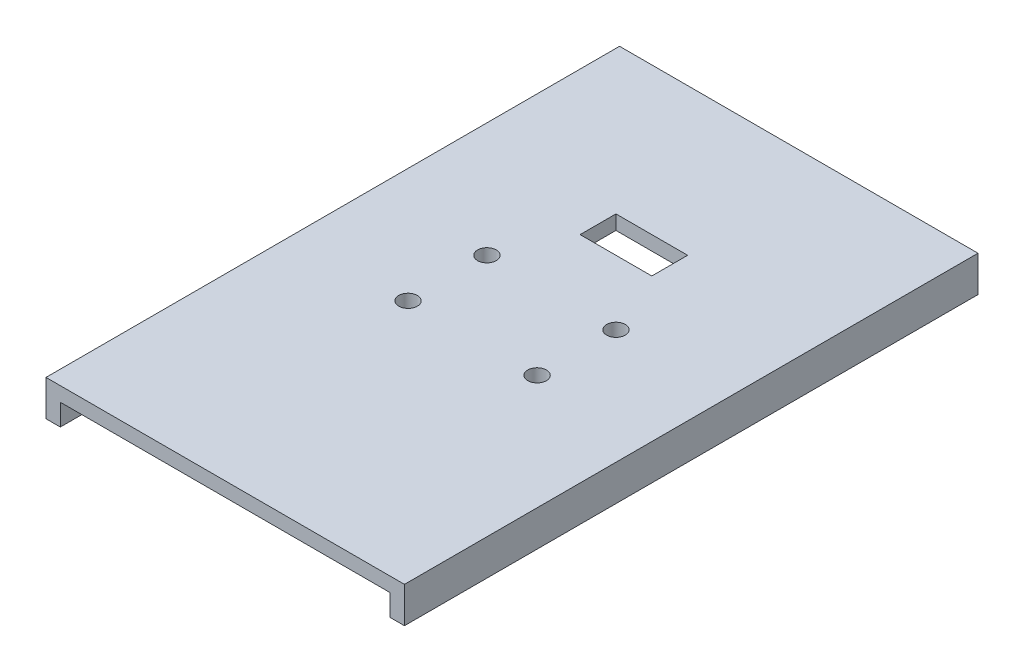
ISO-10303-21;
HEADER;
FILE_DESCRIPTION(('STEP AP214'),'2;1');
FILE_NAME('part.step','',(''),(''),'','','');
FILE_SCHEMA(('AUTOMOTIVE_DESIGN { 1 0 10303 214 1 1 1 1 }'));
ENDSEC;
DATA;
#1=APPLICATION_CONTEXT('core data for automotive mechanical design processes');
#2=APPLICATION_PROTOCOL_DEFINITION('international standard','automotive_design',2000,#1);
#3=PRODUCT_CONTEXT('',#1,'mechanical');
#4=PRODUCT('Part','Part','',(#3));
#5=PRODUCT_RELATED_PRODUCT_CATEGORY('part','',(#4));
#6=PRODUCT_DEFINITION_FORMATION('','',#4);
#7=PRODUCT_DEFINITION_CONTEXT('part definition',#1,'design');
#8=PRODUCT_DEFINITION('design','',#6,#7);
#9=PRODUCT_DEFINITION_SHAPE('','',#8);
#10=(LENGTH_UNIT() NAMED_UNIT(*) SI_UNIT(.MILLI.,.METRE.));
#11=(NAMED_UNIT(*) PLANE_ANGLE_UNIT() SI_UNIT($,.RADIAN.));
#12=(NAMED_UNIT(*) SI_UNIT($,.STERADIAN.) SOLID_ANGLE_UNIT());
#13=UNCERTAINTY_MEASURE_WITH_UNIT(LENGTH_MEASURE(1.E-05),#10,'distance_accuracy_value','');
#14=(GEOMETRIC_REPRESENTATION_CONTEXT(3) GLOBAL_UNCERTAINTY_ASSIGNED_CONTEXT((#13)) GLOBAL_UNIT_ASSIGNED_CONTEXT((#10,
#11,#12)) REPRESENTATION_CONTEXT('',''));
#15=CARTESIAN_POINT('',(0.,0.,0.));
#16=DIRECTION('',(0.,0.,1.));
#17=DIRECTION('',(1.,0.,0.));
#18=AXIS2_PLACEMENT_3D('',#15,#16,#17);
#19=CARTESIAN_POINT('',(0.,2.,0.));
#20=DIRECTION('',(0.,0.,-1.));
#21=DIRECTION('',(-1.,0.,0.));
#22=AXIS2_PLACEMENT_3D('',#19,#20,#21);
#23=PLANE('',#22);
#24=DIRECTION('',(1.,0.,0.));
#25=VECTOR('',#24,1.);
#26=CARTESIAN_POINT('',(0.,0.,0.));
#27=LINE('',#26,#25);
#28=CARTESIAN_POINT('',(-3.,0.,0.));
#29=VERTEX_POINT('',#28);
#30=CARTESIAN_POINT('',(43.,0.,0.));
#31=VERTEX_POINT('',#30);
#32=EDGE_CURVE('E217',#29,#31,#27,.T.);
#33=ORIENTED_EDGE('',*,*,#32,.T.);
#34=DIRECTION('',(0.,-1.,0.));
#35=VECTOR('',#34,1.);
#36=CARTESIAN_POINT('',(43.,-3.,0.));
#37=LINE('',#36,#35);
#38=CARTESIAN_POINT('',(43.,-3.,0.));
#39=VERTEX_POINT('',#38);
#40=EDGE_CURVE('E163',#31,#39,#37,.T.);
#41=ORIENTED_EDGE('',*,*,#40,.T.);
#42=DIRECTION('',(1.,0.,0.));
#43=VECTOR('',#42,1.);
#44=CARTESIAN_POINT('',(45.,-3.,0.));
#45=LINE('',#44,#43);
#46=CARTESIAN_POINT('',(45.,-3.,0.));
#47=VERTEX_POINT('',#46);
#48=EDGE_CURVE('E181',#39,#47,#45,.T.);
#49=ORIENTED_EDGE('',*,*,#48,.T.);
#50=DIRECTION('',(0.,1.,0.));
#51=VECTOR('',#50,1.);
#52=CARTESIAN_POINT('',(45.,2.,0.));
#53=LINE('',#52,#51);
#54=CARTESIAN_POINT('',(45.,2.,0.));
#55=VERTEX_POINT('',#54);
#56=EDGE_CURVE('E172',#47,#55,#53,.T.);
#57=ORIENTED_EDGE('',*,*,#56,.T.);
#58=DIRECTION('',(1.,0.,0.));
#59=VECTOR('',#58,1.);
#60=CARTESIAN_POINT('',(0.,2.,0.));
#61=LINE('',#60,#59);
#62=CARTESIAN_POINT('',(-5.,2.,0.));
#63=VERTEX_POINT('',#62);
#64=EDGE_CURVE('E40',#63,#55,#61,.T.);
#65=ORIENTED_EDGE('',*,*,#64,.F.);
#66=DIRECTION('',(0.,-1.,0.));
#67=VECTOR('',#66,1.);
#68=CARTESIAN_POINT('',(-5.,2.,0.));
#69=LINE('',#68,#67);
#70=CARTESIAN_POINT('',(-5.,-3.,0.));
#71=VERTEX_POINT('',#70);
#72=EDGE_CURVE('E189',#63,#71,#69,.T.);
#73=ORIENTED_EDGE('',*,*,#72,.T.);
#74=DIRECTION('',(1.,0.,0.));
#75=VECTOR('',#74,1.);
#76=CARTESIAN_POINT('',(-5.,-3.,0.));
#77=LINE('',#76,#75);
#78=CARTESIAN_POINT('',(-3.,-3.,0.));
#79=VERTEX_POINT('',#78);
#80=EDGE_CURVE('E209',#71,#79,#77,.T.);
#81=ORIENTED_EDGE('',*,*,#80,.T.);
#82=DIRECTION('',(0.,1.,0.));
#83=VECTOR('',#82,1.);
#84=CARTESIAN_POINT('',(-3.,-3.,0.));
#85=LINE('',#84,#83);
#86=EDGE_CURVE('E200',#79,#29,#85,.T.);
#87=ORIENTED_EDGE('',*,*,#86,.T.);
#88=EDGE_LOOP('',(#33,#41,#49,#57,#65,#73,#81,#87));
#89=FACE_BOUND('',#88,.T.);
#90=ADVANCED_FACE('F32',(#89),#23,.F.);
#91=CARTESIAN_POINT('',(0.,2.,-80.));
#92=DIRECTION('',(0.,0.,1.));
#93=DIRECTION('',(1.,0.,0.));
#94=AXIS2_PLACEMENT_3D('',#91,#92,#93);
#95=PLANE('',#94);
#96=DIRECTION('',(-1.,0.,0.));
#97=VECTOR('',#96,1.);
#98=CARTESIAN_POINT('',(0.,0.,-80.));
#99=LINE('',#98,#97);
#100=CARTESIAN_POINT('',(43.,0.,-80.));
#101=VERTEX_POINT('',#100);
#102=CARTESIAN_POINT('',(-3.,0.,-80.));
#103=VERTEX_POINT('',#102);
#104=EDGE_CURVE('E35',#101,#103,#99,.T.);
#105=ORIENTED_EDGE('',*,*,#104,.T.);
#106=DIRECTION('',(0.,1.,0.));
#107=VECTOR('',#106,1.);
#108=CARTESIAN_POINT('',(-3.,-3.,-80.));
#109=LINE('',#108,#107);
#110=CARTESIAN_POINT('',(-3.,-3.,-80.));
#111=VERTEX_POINT('',#110);
#112=EDGE_CURVE('E203',#111,#103,#109,.T.);
#113=ORIENTED_EDGE('',*,*,#112,.F.);
#114=DIRECTION('',(1.,0.,0.));
#115=VECTOR('',#114,1.);
#116=CARTESIAN_POINT('',(-5.,-3.,-80.));
#117=LINE('',#116,#115);
#118=CARTESIAN_POINT('',(-5.,-3.,-80.));
#119=VERTEX_POINT('',#118);
#120=EDGE_CURVE('E199',#119,#111,#117,.T.);
#121=ORIENTED_EDGE('',*,*,#120,.F.);
#122=DIRECTION('',(0.,-1.,0.));
#123=VECTOR('',#122,1.);
#124=CARTESIAN_POINT('',(-5.,2.,-80.));
#125=LINE('',#124,#123);
#126=CARTESIAN_POINT('',(-5.,2.,-80.));
#127=VERTEX_POINT('',#126);
#128=EDGE_CURVE('E196',#127,#119,#125,.T.);
#129=ORIENTED_EDGE('',*,*,#128,.F.);
#130=DIRECTION('',(-1.,0.,0.));
#131=VECTOR('',#130,1.);
#132=CARTESIAN_POINT('',(0.,2.,-80.));
#133=LINE('',#132,#131);
#134=CARTESIAN_POINT('',(45.,2.,-80.));
#135=VERTEX_POINT('',#134);
#136=EDGE_CURVE('E11',#135,#127,#133,.T.);
#137=ORIENTED_EDGE('',*,*,#136,.F.);
#138=DIRECTION('',(0.,1.,0.));
#139=VECTOR('',#138,1.);
#140=CARTESIAN_POINT('',(45.,2.,-80.));
#141=LINE('',#140,#139);
#142=CARTESIAN_POINT('',(45.,-3.,-80.));
#143=VERTEX_POINT('',#142);
#144=EDGE_CURVE('E175',#143,#135,#141,.T.);
#145=ORIENTED_EDGE('',*,*,#144,.F.);
#146=DIRECTION('',(1.,0.,0.));
#147=VECTOR('',#146,1.);
#148=CARTESIAN_POINT('',(45.,-3.,-80.));
#149=LINE('',#148,#147);
#150=CARTESIAN_POINT('',(43.,-3.,-80.));
#151=VERTEX_POINT('',#150);
#152=EDGE_CURVE('E171',#151,#143,#149,.T.);
#153=ORIENTED_EDGE('',*,*,#152,.F.);
#154=DIRECTION('',(0.,-1.,0.));
#155=VECTOR('',#154,1.);
#156=CARTESIAN_POINT('',(43.,-3.,-80.));
#157=LINE('',#156,#155);
#158=EDGE_CURVE('E168',#101,#151,#157,.T.);
#159=ORIENTED_EDGE('',*,*,#158,.F.);
#160=EDGE_LOOP('',(#105,#113,#121,#129,#137,#145,#153,#159));
#161=FACE_BOUND('',#160,.T.);
#162=ADVANCED_FACE('F229',(#161),#95,.F.);
#163=CARTESIAN_POINT('',(0.,2.,0.));
#164=DIRECTION('',(0.,-1.,0.));
#165=DIRECTION('',(0.,0.,-1.));
#166=AXIS2_PLACEMENT_3D('',#163,#164,#165);
#167=PLANE('',#166);
#168=DIRECTION('',(1.,0.,0.));
#169=VECTOR('',#168,1.);
#170=CARTESIAN_POINT('',(15.,2.,-54.5));
#171=LINE('',#170,#169);
#172=CARTESIAN_POINT('',(15.,2.,-54.5));
#173=VERTEX_POINT('',#172);
#174=CARTESIAN_POINT('',(25.,2.,-54.5));
#175=VERTEX_POINT('',#174);
#176=EDGE_CURVE('E151',#173,#175,#171,.T.);
#177=ORIENTED_EDGE('',*,*,#176,.F.);
#178=DIRECTION('',(0.,0.,1.));
#179=VECTOR('',#178,1.);
#180=CARTESIAN_POINT('',(15.,2.,-59.5));
#181=LINE('',#180,#179);
#182=CARTESIAN_POINT('',(15.,2.,-59.5));
#183=VERTEX_POINT('',#182);
#184=EDGE_CURVE('E48',#183,#173,#181,.T.);
#185=ORIENTED_EDGE('',*,*,#184,.F.);
#186=DIRECTION('',(-1.,0.,0.));
#187=VECTOR('',#186,1.);
#188=CARTESIAN_POINT('',(15.,2.,-59.5));
#189=LINE('',#188,#187);
#190=CARTESIAN_POINT('',(25.,2.,-59.5));
#191=VERTEX_POINT('',#190);
#192=EDGE_CURVE('E139',#191,#183,#189,.T.);
#193=ORIENTED_EDGE('',*,*,#192,.F.);
#194=DIRECTION('',(0.,0.,-1.));
#195=VECTOR('',#194,1.);
#196=CARTESIAN_POINT('',(25.,2.,-59.5));
#197=LINE('',#196,#195);
#198=EDGE_CURVE('E142',#175,#191,#197,.T.);
#199=ORIENTED_EDGE('',*,*,#198,.F.);
#200=EDGE_LOOP('',(#177,#185,#193,#199));
#201=FACE_BOUND('',#200,.T.);
#202=CARTESIAN_POINT('',(11.,2.,-34.5));
#203=DIRECTION('',(0.,1.,0.));
#204=DIRECTION('',(0.,0.,1.));
#205=AXIS2_PLACEMENT_3D('',#202,#203,#204);
#206=CIRCLE('',#205,1.3);
#207=CARTESIAN_POINT('',(11.,2.,-33.2));
#208=VERTEX_POINT('',#207);
#209=EDGE_CURVE('E145',#208,#208,#206,.T.);
#210=ORIENTED_EDGE('',*,*,#209,.F.);
#211=EDGE_LOOP('',(#210));
#212=FACE_BOUND('',#211,.T.);
#213=CARTESIAN_POINT('',(29.,2.,-34.5));
#214=DIRECTION('',(0.,1.,0.));
#215=DIRECTION('',(0.,0.,-1.));
#216=AXIS2_PLACEMENT_3D('',#213,#214,#215);
#217=CIRCLE('',#216,1.3);
#218=CARTESIAN_POINT('',(29.,2.,-35.8));
#219=VERTEX_POINT('',#218);
#220=EDGE_CURVE('E403',#219,#219,#217,.T.);
#221=ORIENTED_EDGE('',*,*,#220,.F.);
#222=EDGE_LOOP('',(#221));
#223=FACE_BOUND('',#222,.T.);
#224=CARTESIAN_POINT('',(29.,2.,-45.5));
#225=DIRECTION('',(0.,1.,0.));
#226=DIRECTION('',(0.,0.,-1.));
#227=AXIS2_PLACEMENT_3D('',#224,#225,#226);
#228=CIRCLE('',#227,1.3);
#229=CARTESIAN_POINT('',(29.,2.,-46.8));
#230=VERTEX_POINT('',#229);
#231=EDGE_CURVE('E407',#230,#230,#228,.T.);
#232=ORIENTED_EDGE('',*,*,#231,.F.);
#233=EDGE_LOOP('',(#232));
#234=FACE_BOUND('',#233,.T.);
#235=CARTESIAN_POINT('',(11.,2.,-45.5));
#236=DIRECTION('',(0.,1.,0.));
#237=DIRECTION('',(0.,0.,1.));
#238=AXIS2_PLACEMENT_3D('',#235,#236,#237);
#239=CIRCLE('',#238,1.3);
#240=CARTESIAN_POINT('',(11.,2.,-44.2));
#241=VERTEX_POINT('',#240);
#242=EDGE_CURVE('E164',#241,#241,#239,.T.);
#243=ORIENTED_EDGE('',*,*,#242,.F.);
#244=EDGE_LOOP('',(#243));
#245=FACE_BOUND('',#244,.T.);
#246=ORIENTED_EDGE('',*,*,#136,.T.);
#247=DIRECTION('',(0.,0.,1.));
#248=VECTOR('',#247,1.);
#249=CARTESIAN_POINT('',(-5.,2.,-80.));
#250=LINE('',#249,#248);
#251=EDGE_CURVE('E206',#127,#63,#250,.T.);
#252=ORIENTED_EDGE('',*,*,#251,.T.);
#253=ORIENTED_EDGE('',*,*,#64,.T.);
#254=DIRECTION('',(0.,0.,1.));
#255=VECTOR('',#254,1.);
#256=CARTESIAN_POINT('',(45.,2.,-80.));
#257=LINE('',#256,#255);
#258=EDGE_CURVE('E190',#135,#55,#257,.T.);
#259=ORIENTED_EDGE('',*,*,#258,.F.);
#260=EDGE_LOOP('',(#246,#252,#253,#259));
#261=FACE_BOUND('',#260,.T.);
#262=ADVANCED_FACE('F246',(#201,#212,#223,#234,#245,#261),#167,.F.);
#263=CARTESIAN_POINT('',(0.,0.,0.));
#264=DIRECTION('',(0.,-1.,0.));
#265=DIRECTION('',(0.,0.,-1.));
#266=AXIS2_PLACEMENT_3D('',#263,#264,#265);
#267=PLANE('',#266);
#268=DIRECTION('',(0.,0.,1.));
#269=VECTOR('',#268,1.);
#270=CARTESIAN_POINT('',(15.,0.,-59.5));
#271=LINE('',#270,#269);
#272=CARTESIAN_POINT('',(15.,0.,-59.5));
#273=VERTEX_POINT('',#272);
#274=CARTESIAN_POINT('',(15.,0.,-54.5));
#275=VERTEX_POINT('',#274);
#276=EDGE_CURVE('E123',#273,#275,#271,.T.);
#277=ORIENTED_EDGE('',*,*,#276,.T.);
#278=DIRECTION('',(1.,0.,0.));
#279=VECTOR('',#278,1.);
#280=CARTESIAN_POINT('',(15.,0.,-54.5));
#281=LINE('',#280,#279);
#282=CARTESIAN_POINT('',(25.,0.,-54.5));
#283=VERTEX_POINT('',#282);
#284=EDGE_CURVE('E132',#275,#283,#281,.T.);
#285=ORIENTED_EDGE('',*,*,#284,.T.);
#286=DIRECTION('',(0.,0.,-1.));
#287=VECTOR('',#286,1.);
#288=CARTESIAN_POINT('',(25.,0.,-59.5));
#289=LINE('',#288,#287);
#290=CARTESIAN_POINT('',(25.,0.,-59.5));
#291=VERTEX_POINT('',#290);
#292=EDGE_CURVE('E56',#283,#291,#289,.T.);
#293=ORIENTED_EDGE('',*,*,#292,.T.);
#294=DIRECTION('',(-1.,0.,0.));
#295=VECTOR('',#294,1.);
#296=CARTESIAN_POINT('',(15.,0.,-59.5));
#297=LINE('',#296,#295);
#298=EDGE_CURVE('E129',#291,#273,#297,.T.);
#299=ORIENTED_EDGE('',*,*,#298,.T.);
#300=EDGE_LOOP('',(#277,#285,#293,#299));
#301=FACE_BOUND('',#300,.T.);
#302=CARTESIAN_POINT('',(11.,0.,-34.5));
#303=DIRECTION('',(0.,1.,0.));
#304=DIRECTION('',(0.,0.,1.));
#305=AXIS2_PLACEMENT_3D('',#302,#303,#304);
#306=CIRCLE('',#305,1.3);
#307=CARTESIAN_POINT('',(11.,0.,-33.2));
#308=VERTEX_POINT('',#307);
#309=EDGE_CURVE('E418',#308,#308,#306,.T.);
#310=ORIENTED_EDGE('',*,*,#309,.T.);
#311=EDGE_LOOP('',(#310));
#312=FACE_BOUND('',#311,.T.);
#313=CARTESIAN_POINT('',(29.,0.,-34.5));
#314=DIRECTION('',(0.,1.,0.));
#315=DIRECTION('',(0.,0.,-1.));
#316=AXIS2_PLACEMENT_3D('',#313,#314,#315);
#317=CIRCLE('',#316,1.3);
#318=CARTESIAN_POINT('',(29.,0.,-35.8));
#319=VERTEX_POINT('',#318);
#320=EDGE_CURVE('E411',#319,#319,#317,.T.);
#321=ORIENTED_EDGE('',*,*,#320,.T.);
#322=EDGE_LOOP('',(#321));
#323=FACE_BOUND('',#322,.T.);
#324=CARTESIAN_POINT('',(29.,0.,-45.5));
#325=DIRECTION('',(0.,1.,0.));
#326=DIRECTION('',(0.,0.,-1.));
#327=AXIS2_PLACEMENT_3D('',#324,#325,#326);
#328=CIRCLE('',#327,1.3);
#329=CARTESIAN_POINT('',(29.,0.,-46.8));
#330=VERTEX_POINT('',#329);
#331=EDGE_CURVE('E167',#330,#330,#328,.T.);
#332=ORIENTED_EDGE('',*,*,#331,.T.);
#333=EDGE_LOOP('',(#332));
#334=FACE_BOUND('',#333,.T.);
#335=CARTESIAN_POINT('',(11.,0.,-45.5));
#336=DIRECTION('',(0.,1.,0.));
#337=DIRECTION('',(0.,0.,1.));
#338=AXIS2_PLACEMENT_3D('',#335,#336,#337);
#339=CIRCLE('',#338,1.3);
#340=CARTESIAN_POINT('',(11.,0.,-44.2));
#341=VERTEX_POINT('',#340);
#342=EDGE_CURVE('E160',#341,#341,#339,.T.);
#343=ORIENTED_EDGE('',*,*,#342,.T.);
#344=EDGE_LOOP('',(#343));
#345=FACE_BOUND('',#344,.T.);
#346=ORIENTED_EDGE('',*,*,#32,.F.);
#347=DIRECTION('',(0.,0.,1.));
#348=VECTOR('',#347,1.);
#349=CARTESIAN_POINT('',(-3.,0.,-80.));
#350=LINE('',#349,#348);
#351=EDGE_CURVE('E214',#103,#29,#350,.T.);
#352=ORIENTED_EDGE('',*,*,#351,.F.);
#353=ORIENTED_EDGE('',*,*,#104,.F.);
#354=DIRECTION('',(0.,0.,1.));
#355=VECTOR('',#354,1.);
#356=CARTESIAN_POINT('',(43.,0.,-80.));
#357=LINE('',#356,#355);
#358=EDGE_CURVE('E186',#101,#31,#357,.T.);
#359=ORIENTED_EDGE('',*,*,#358,.T.);
#360=EDGE_LOOP('',(#346,#352,#353,#359));
#361=FACE_BOUND('',#360,.T.);
#362=ADVANCED_FACE('F136',(#301,#312,#323,#334,#345,#361),#267,.T.);
#363=CARTESIAN_POINT('',(-3.,-3.,-80.));
#364=DIRECTION('',(1.,0.,0.));
#365=DIRECTION('',(0.,0.,-1.));
#366=AXIS2_PLACEMENT_3D('',#363,#364,#365);
#367=PLANE('',#366);
#368=ORIENTED_EDGE('',*,*,#86,.F.);
#369=DIRECTION('',(0.,0.,1.));
#370=VECTOR('',#369,1.);
#371=CARTESIAN_POINT('',(-3.,-3.,-80.));
#372=LINE('',#371,#370);
#373=EDGE_CURVE('E218',#111,#79,#372,.T.);
#374=ORIENTED_EDGE('',*,*,#373,.F.);
#375=ORIENTED_EDGE('',*,*,#112,.T.);
#376=ORIENTED_EDGE('',*,*,#351,.T.);
#377=EDGE_LOOP('',(#368,#374,#375,#376));
#378=FACE_BOUND('',#377,.T.);
#379=ADVANCED_FACE('F236',(#378),#367,.T.);
#380=CARTESIAN_POINT('',(-5.,-3.,-80.));
#381=DIRECTION('',(0.,-1.,0.));
#382=DIRECTION('',(1.,0.,0.));
#383=AXIS2_PLACEMENT_3D('',#380,#381,#382);
#384=PLANE('',#383);
#385=ORIENTED_EDGE('',*,*,#80,.F.);
#386=DIRECTION('',(0.,0.,1.));
#387=VECTOR('',#386,1.);
#388=CARTESIAN_POINT('',(-5.,-3.,-80.));
#389=LINE('',#388,#387);
#390=EDGE_CURVE('E220',#119,#71,#389,.T.);
#391=ORIENTED_EDGE('',*,*,#390,.F.);
#392=ORIENTED_EDGE('',*,*,#120,.T.);
#393=ORIENTED_EDGE('',*,*,#373,.T.);
#394=EDGE_LOOP('',(#385,#391,#392,#393));
#395=FACE_BOUND('',#394,.T.);
#396=ADVANCED_FACE('F239',(#395),#384,.T.);
#397=CARTESIAN_POINT('',(-5.,2.,-80.));
#398=DIRECTION('',(-1.,0.,0.));
#399=DIRECTION('',(0.,-1.,0.));
#400=AXIS2_PLACEMENT_3D('',#397,#398,#399);
#401=PLANE('',#400);
#402=ORIENTED_EDGE('',*,*,#72,.F.);
#403=ORIENTED_EDGE('',*,*,#251,.F.);
#404=ORIENTED_EDGE('',*,*,#128,.T.);
#405=ORIENTED_EDGE('',*,*,#390,.T.);
#406=EDGE_LOOP('',(#402,#403,#404,#405));
#407=FACE_BOUND('',#406,.T.);
#408=ADVANCED_FACE('F244',(#407),#401,.T.);
#409=CARTESIAN_POINT('',(43.,-3.,-80.));
#410=DIRECTION('',(-1.,0.,0.));
#411=DIRECTION('',(0.,0.,1.));
#412=AXIS2_PLACEMENT_3D('',#409,#410,#411);
#413=PLANE('',#412);
#414=ORIENTED_EDGE('',*,*,#40,.F.);
#415=ORIENTED_EDGE('',*,*,#358,.F.);
#416=ORIENTED_EDGE('',*,*,#158,.T.);
#417=DIRECTION('',(0.,0.,1.));
#418=VECTOR('',#417,1.);
#419=CARTESIAN_POINT('',(43.,-3.,-80.));
#420=LINE('',#419,#418);
#421=EDGE_CURVE('E178',#151,#39,#420,.T.);
#422=ORIENTED_EDGE('',*,*,#421,.T.);
#423=EDGE_LOOP('',(#414,#415,#416,#422));
#424=FACE_BOUND('',#423,.T.);
#425=ADVANCED_FACE('F256',(#424),#413,.T.);
#426=CARTESIAN_POINT('',(45.,2.,-80.));
#427=DIRECTION('',(1.,0.,0.));
#428=DIRECTION('',(0.,0.,-1.));
#429=AXIS2_PLACEMENT_3D('',#426,#427,#428);
#430=PLANE('',#429);
#431=ORIENTED_EDGE('',*,*,#56,.F.);
#432=DIRECTION('',(0.,0.,1.));
#433=VECTOR('',#432,1.);
#434=CARTESIAN_POINT('',(45.,-3.,-80.));
#435=LINE('',#434,#433);
#436=EDGE_CURVE('E193',#143,#47,#435,.T.);
#437=ORIENTED_EDGE('',*,*,#436,.F.);
#438=ORIENTED_EDGE('',*,*,#144,.T.);
#439=ORIENTED_EDGE('',*,*,#258,.T.);
#440=EDGE_LOOP('',(#431,#437,#438,#439));
#441=FACE_BOUND('',#440,.T.);
#442=ADVANCED_FACE('F257',(#441),#430,.T.);
#443=CARTESIAN_POINT('',(45.,-3.,-80.));
#444=DIRECTION('',(0.,-1.,0.));
#445=DIRECTION('',(1.,0.,0.));
#446=AXIS2_PLACEMENT_3D('',#443,#444,#445);
#447=PLANE('',#446);
#448=ORIENTED_EDGE('',*,*,#48,.F.);
#449=ORIENTED_EDGE('',*,*,#421,.F.);
#450=ORIENTED_EDGE('',*,*,#152,.T.);
#451=ORIENTED_EDGE('',*,*,#436,.T.);
#452=EDGE_LOOP('',(#448,#449,#450,#451));
#453=FACE_BOUND('',#452,.T.);
#454=ADVANCED_FACE('F252',(#453),#447,.T.);
#455=CARTESIAN_POINT('',(11.,0.,-45.5));
#456=DIRECTION('',(0.,1.,0.));
#457=DIRECTION('',(0.,0.,1.));
#458=AXIS2_PLACEMENT_3D('',#455,#456,#457);
#459=CYLINDRICAL_SURFACE('',#458,1.3);
#460=ORIENTED_EDGE('',*,*,#342,.F.);
#461=EDGE_LOOP('',(#460));
#462=FACE_BOUND('',#461,.T.);
#463=ORIENTED_EDGE('',*,*,#242,.T.);
#464=EDGE_LOOP('',(#463));
#465=FACE_BOUND('',#464,.T.);
#466=ADVANCED_FACE('F264',(#462,#465),#459,.F.);
#467=CARTESIAN_POINT('',(29.,0.,-45.5));
#468=DIRECTION('',(0.,1.,0.));
#469=DIRECTION('',(0.,0.,1.));
#470=AXIS2_PLACEMENT_3D('',#467,#468,#469);
#471=CYLINDRICAL_SURFACE('',#470,1.3);
#472=ORIENTED_EDGE('',*,*,#331,.F.);
#473=EDGE_LOOP('',(#472));
#474=FACE_BOUND('',#473,.T.);
#475=ORIENTED_EDGE('',*,*,#231,.T.);
#476=EDGE_LOOP('',(#475));
#477=FACE_BOUND('',#476,.T.);
#478=ADVANCED_FACE('F326',(#474,#477),#471,.F.);
#479=CARTESIAN_POINT('',(29.,0.,-34.5));
#480=DIRECTION('',(0.,1.,0.));
#481=DIRECTION('',(0.,0.,1.));
#482=AXIS2_PLACEMENT_3D('',#479,#480,#481);
#483=CYLINDRICAL_SURFACE('',#482,1.3);
#484=ORIENTED_EDGE('',*,*,#320,.F.);
#485=EDGE_LOOP('',(#484));
#486=FACE_BOUND('',#485,.T.);
#487=ORIENTED_EDGE('',*,*,#220,.T.);
#488=EDGE_LOOP('',(#487));
#489=FACE_BOUND('',#488,.T.);
#490=ADVANCED_FACE('F335',(#486,#489),#483,.F.);
#491=CARTESIAN_POINT('',(11.,0.,-34.5));
#492=DIRECTION('',(0.,1.,0.));
#493=DIRECTION('',(0.,0.,1.));
#494=AXIS2_PLACEMENT_3D('',#491,#492,#493);
#495=CYLINDRICAL_SURFACE('',#494,1.3);
#496=ORIENTED_EDGE('',*,*,#309,.F.);
#497=EDGE_LOOP('',(#496));
#498=FACE_BOUND('',#497,.T.);
#499=ORIENTED_EDGE('',*,*,#209,.T.);
#500=EDGE_LOOP('',(#499));
#501=FACE_BOUND('',#500,.T.);
#502=ADVANCED_FACE('F345',(#498,#501),#495,.F.);
#503=CARTESIAN_POINT('',(15.,0.,-59.5));
#504=DIRECTION('',(-1.,0.,0.));
#505=DIRECTION('',(0.,0.,1.));
#506=AXIS2_PLACEMENT_3D('',#503,#504,#505);
#507=PLANE('',#506);
#508=ORIENTED_EDGE('',*,*,#184,.T.);
#509=DIRECTION('',(0.,1.,0.));
#510=VECTOR('',#509,1.);
#511=CARTESIAN_POINT('',(15.,0.,-54.5));
#512=LINE('',#511,#510);
#513=EDGE_CURVE('E119',#275,#173,#512,.T.);
#514=ORIENTED_EDGE('',*,*,#513,.F.);
#515=ORIENTED_EDGE('',*,*,#276,.F.);
#516=DIRECTION('',(0.,1.,0.));
#517=VECTOR('',#516,1.);
#518=CARTESIAN_POINT('',(15.,0.,-59.5));
#519=LINE('',#518,#517);
#520=EDGE_CURVE('E155',#273,#183,#519,.T.);
#521=ORIENTED_EDGE('',*,*,#520,.T.);
#522=EDGE_LOOP('',(#508,#514,#515,#521));
#523=FACE_BOUND('',#522,.T.);
#524=ADVANCED_FACE('F121',(#523),#507,.F.);
#525=CARTESIAN_POINT('',(15.,0.,-59.5));
#526=DIRECTION('',(0.,0.,-1.));
#527=DIRECTION('',(-1.,0.,0.));
#528=AXIS2_PLACEMENT_3D('',#525,#526,#527);
#529=PLANE('',#528);
#530=ORIENTED_EDGE('',*,*,#192,.T.);
#531=ORIENTED_EDGE('',*,*,#520,.F.);
#532=ORIENTED_EDGE('',*,*,#298,.F.);
#533=DIRECTION('',(0.,1.,0.));
#534=VECTOR('',#533,1.);
#535=CARTESIAN_POINT('',(25.,0.,-59.5));
#536=LINE('',#535,#534);
#537=EDGE_CURVE('E157',#291,#191,#536,.T.);
#538=ORIENTED_EDGE('',*,*,#537,.T.);
#539=EDGE_LOOP('',(#530,#531,#532,#538));
#540=FACE_BOUND('',#539,.T.);
#541=ADVANCED_FACE('F364',(#540),#529,.F.);
#542=CARTESIAN_POINT('',(25.,0.,-59.5));
#543=DIRECTION('',(1.,0.,0.));
#544=DIRECTION('',(0.,0.,-1.));
#545=AXIS2_PLACEMENT_3D('',#542,#543,#544);
#546=PLANE('',#545);
#547=ORIENTED_EDGE('',*,*,#198,.T.);
#548=ORIENTED_EDGE('',*,*,#537,.F.);
#549=ORIENTED_EDGE('',*,*,#292,.F.);
#550=DIRECTION('',(0.,1.,0.));
#551=VECTOR('',#550,1.);
#552=CARTESIAN_POINT('',(25.,0.,-54.5));
#553=LINE('',#552,#551);
#554=EDGE_CURVE('E128',#283,#175,#553,.T.);
#555=ORIENTED_EDGE('',*,*,#554,.T.);
#556=EDGE_LOOP('',(#547,#548,#549,#555));
#557=FACE_BOUND('',#556,.T.);
#558=ADVANCED_FACE('F373',(#557),#546,.F.);
#559=CARTESIAN_POINT('',(15.,0.,-54.5));
#560=DIRECTION('',(0.,0.,1.));
#561=DIRECTION('',(1.,0.,0.));
#562=AXIS2_PLACEMENT_3D('',#559,#560,#561);
#563=PLANE('',#562);
#564=ORIENTED_EDGE('',*,*,#176,.T.);
#565=ORIENTED_EDGE('',*,*,#554,.F.);
#566=ORIENTED_EDGE('',*,*,#284,.F.);
#567=ORIENTED_EDGE('',*,*,#513,.T.);
#568=EDGE_LOOP('',(#564,#565,#566,#567));
#569=FACE_BOUND('',#568,.T.);
#570=ADVANCED_FACE('F133',(#569),#563,.F.);
#571=CLOSED_SHELL('',(#90,#162,#262,#362,#379,#396,#408,#425,#442,#454,#466,#478,#490,#502,#524,
#541,#558,#570));
#572=MANIFOLD_SOLID_BREP('B2',#571);
#573=ADVANCED_BREP_SHAPE_REPRESENTATION('',(#18,#572),#14);
#574=SHAPE_DEFINITION_REPRESENTATION(#9,#573);
ENDSEC;
END-ISO-10303-21;
